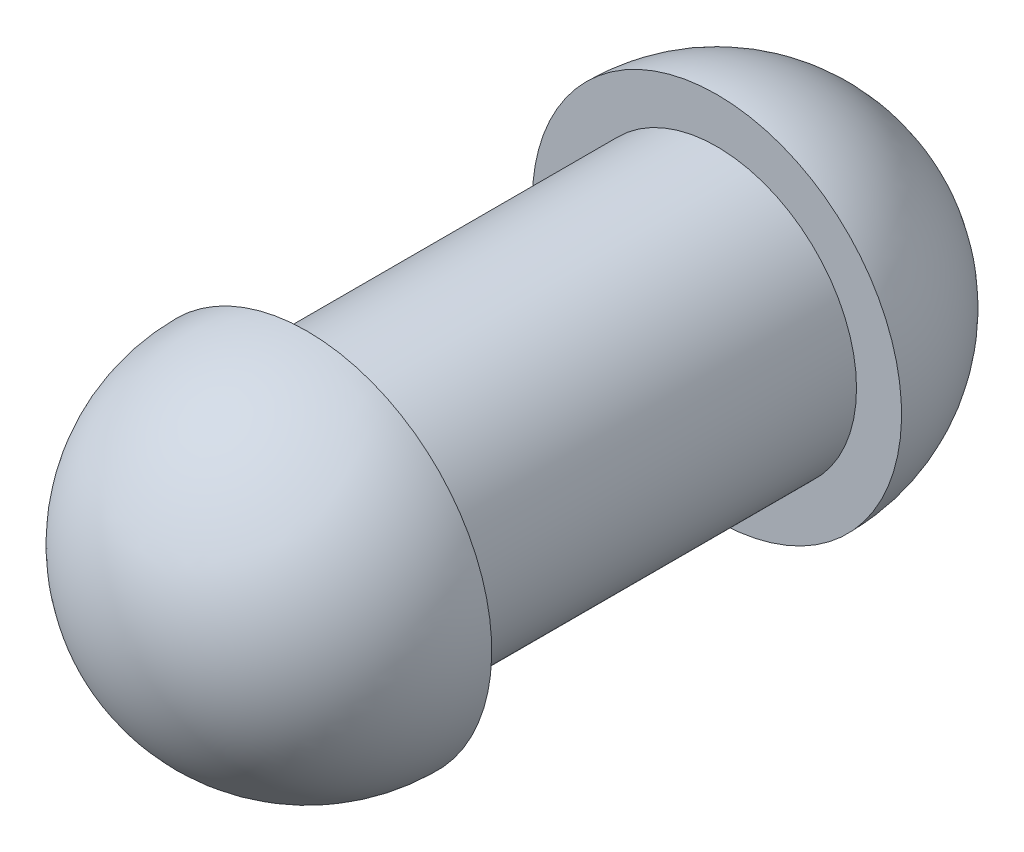
ISO-10303-21;
HEADER;
FILE_DESCRIPTION(('STEP AP214'),'2;1');
FILE_NAME('part.step','',(''),(''),'','','');
FILE_SCHEMA(('AUTOMOTIVE_DESIGN { 1 0 10303 214 1 1 1 1 }'));
ENDSEC;
DATA;
#1=APPLICATION_CONTEXT('core data for automotive mechanical design processes');
#2=APPLICATION_PROTOCOL_DEFINITION('international standard','automotive_design',2000,#1);
#3=PRODUCT_CONTEXT('',#1,'mechanical');
#4=PRODUCT('Part','Part','',(#3));
#5=PRODUCT_RELATED_PRODUCT_CATEGORY('part','',(#4));
#6=PRODUCT_DEFINITION_FORMATION('','',#4);
#7=PRODUCT_DEFINITION_CONTEXT('part definition',#1,'design');
#8=PRODUCT_DEFINITION('design','',#6,#7);
#9=PRODUCT_DEFINITION_SHAPE('','',#8);
#10=(LENGTH_UNIT() NAMED_UNIT(*) SI_UNIT(.MILLI.,.METRE.));
#11=(NAMED_UNIT(*) PLANE_ANGLE_UNIT() SI_UNIT($,.RADIAN.));
#12=(NAMED_UNIT(*) SI_UNIT($,.STERADIAN.) SOLID_ANGLE_UNIT());
#13=UNCERTAINTY_MEASURE_WITH_UNIT(LENGTH_MEASURE(1.E-05),#10,'distance_accuracy_value','');
#14=(GEOMETRIC_REPRESENTATION_CONTEXT(3) GLOBAL_UNCERTAINTY_ASSIGNED_CONTEXT((#13)) GLOBAL_UNIT_ASSIGNED_CONTEXT((#10,
#11,#12)) REPRESENTATION_CONTEXT('',''));
#15=CARTESIAN_POINT('',(0.,0.,0.));
#16=DIRECTION('',(0.,0.,1.));
#17=DIRECTION('',(1.,0.,0.));
#18=AXIS2_PLACEMENT_3D('',#15,#16,#17);
#19=CARTESIAN_POINT('',(0.,0.,22.75));
#20=DIRECTION('',(0.,0.,-1.));
#21=DIRECTION('',(-1.,0.,0.));
#22=AXIS2_PLACEMENT_3D('',#19,#20,#21);
#23=CYLINDRICAL_SURFACE('',#22,15.5);
#24=CARTESIAN_POINT('',(0.,0.,22.75));
#25=DIRECTION('',(0.,0.,1.));
#26=DIRECTION('',(1.,0.,0.));
#27=AXIS2_PLACEMENT_3D('',#24,#25,#26);
#28=CIRCLE('',#27,15.5);
#29=CARTESIAN_POINT('',(15.5,0.,22.75));
#30=VERTEX_POINT('',#29);
#31=EDGE_CURVE('E10',#30,#30,#28,.T.);
#32=ORIENTED_EDGE('',*,*,#31,.F.);
#33=EDGE_LOOP('',(#32));
#34=FACE_BOUND('',#33,.T.);
#35=CARTESIAN_POINT('',(0.,0.,-22.75));
#36=DIRECTION('',(0.,0.,1.));
#37=DIRECTION('',(1.,0.,0.));
#38=AXIS2_PLACEMENT_3D('',#35,#36,#37);
#39=CIRCLE('',#38,15.5);
#40=CARTESIAN_POINT('',(15.5,0.,-22.75));
#41=VERTEX_POINT('',#40);
#42=EDGE_CURVE('E51',#41,#41,#39,.T.);
#43=ORIENTED_EDGE('',*,*,#42,.T.);
#44=EDGE_LOOP('',(#43));
#45=FACE_BOUND('',#44,.T.);
#46=ADVANCED_FACE('F39',(#34,#45),#23,.T.);
#47=CARTESIAN_POINT('',(0.,0.,22.75));
#48=DIRECTION('',(0.,0.,-1.));
#49=DIRECTION('',(-1.,0.,0.));
#50=AXIS2_PLACEMENT_3D('',#47,#48,#49);
#51=PLANE('',#50);
#52=ORIENTED_EDGE('',*,*,#31,.T.);
#53=EDGE_LOOP('',(#52));
#54=FACE_BOUND('',#53,.T.);
#55=CARTESIAN_POINT('',(0.,0.,22.75));
#56=DIRECTION('',(0.,0.,-1.));
#57=DIRECTION('',(-1.,0.,0.));
#58=AXIS2_PLACEMENT_3D('',#55,#56,#57);
#59=CIRCLE('',#58,20.5);
#60=CARTESIAN_POINT('',(-20.5,0.,22.75));
#61=VERTEX_POINT('',#60);
#62=EDGE_CURVE('E46',#61,#61,#59,.T.);
#63=ORIENTED_EDGE('',*,*,#62,.T.);
#64=EDGE_LOOP('',(#63));
#65=FACE_BOUND('',#64,.T.);
#66=ADVANCED_FACE('F75',(#54,#65),#51,.T.);
#67=CARTESIAN_POINT('',(0.,0.,22.75));
#68=DIRECTION('',(0.,0.,-1.));
#69=DIRECTION('',(0.,1.,0.));
#70=AXIS2_PLACEMENT_3D('',#67,#68,#69);
#71=SPHERICAL_SURFACE('',#70,20.5);
#72=ORIENTED_EDGE('',*,*,#62,.F.);
#73=EDGE_LOOP('',(#72));
#74=FACE_BOUND('',#73,.T.);
#75=ADVANCED_FACE('F67',(#74),#71,.T.);
#76=CARTESIAN_POINT('',(0.,0.,-22.75));
#77=DIRECTION('',(0.,0.,1.));
#78=DIRECTION('',(-1.,0.,0.));
#79=AXIS2_PLACEMENT_3D('',#76,#77,#78);
#80=PLANE('',#79);
#81=ORIENTED_EDGE('',*,*,#42,.F.);
#82=EDGE_LOOP('',(#81));
#83=FACE_BOUND('',#82,.T.);
#84=CARTESIAN_POINT('',(0.,0.,-22.75));
#85=DIRECTION('',(0.,0.,-1.));
#86=DIRECTION('',(-1.,0.,0.));
#87=AXIS2_PLACEMENT_3D('',#84,#85,#86);
#88=CIRCLE('',#87,20.5);
#89=CARTESIAN_POINT('',(-20.5,0.,-22.75));
#90=VERTEX_POINT('',#89);
#91=EDGE_CURVE('E56',#90,#90,#88,.T.);
#92=ORIENTED_EDGE('',*,*,#91,.F.);
#93=EDGE_LOOP('',(#92));
#94=FACE_BOUND('',#93,.T.);
#95=ADVANCED_FACE('F65',(#83,#94),#80,.T.);
#96=CARTESIAN_POINT('',(0.,0.,-22.75));
#97=DIRECTION('',(0.,0.,1.));
#98=DIRECTION('',(0.,1.,0.));
#99=AXIS2_PLACEMENT_3D('',#96,#97,#98);
#100=SPHERICAL_SURFACE('',#99,20.5);
#101=ORIENTED_EDGE('',*,*,#91,.T.);
#102=EDGE_LOOP('',(#101));
#103=FACE_BOUND('',#102,.T.);
#104=ADVANCED_FACE('F63',(#103),#100,.T.);
#105=CLOSED_SHELL('',(#46,#66,#75,#95,#104));
#106=MANIFOLD_SOLID_BREP('B2',#105);
#107=ADVANCED_BREP_SHAPE_REPRESENTATION('',(#18,#106),#14);
#108=SHAPE_DEFINITION_REPRESENTATION(#9,#107);
ENDSEC;
END-ISO-10303-21;
